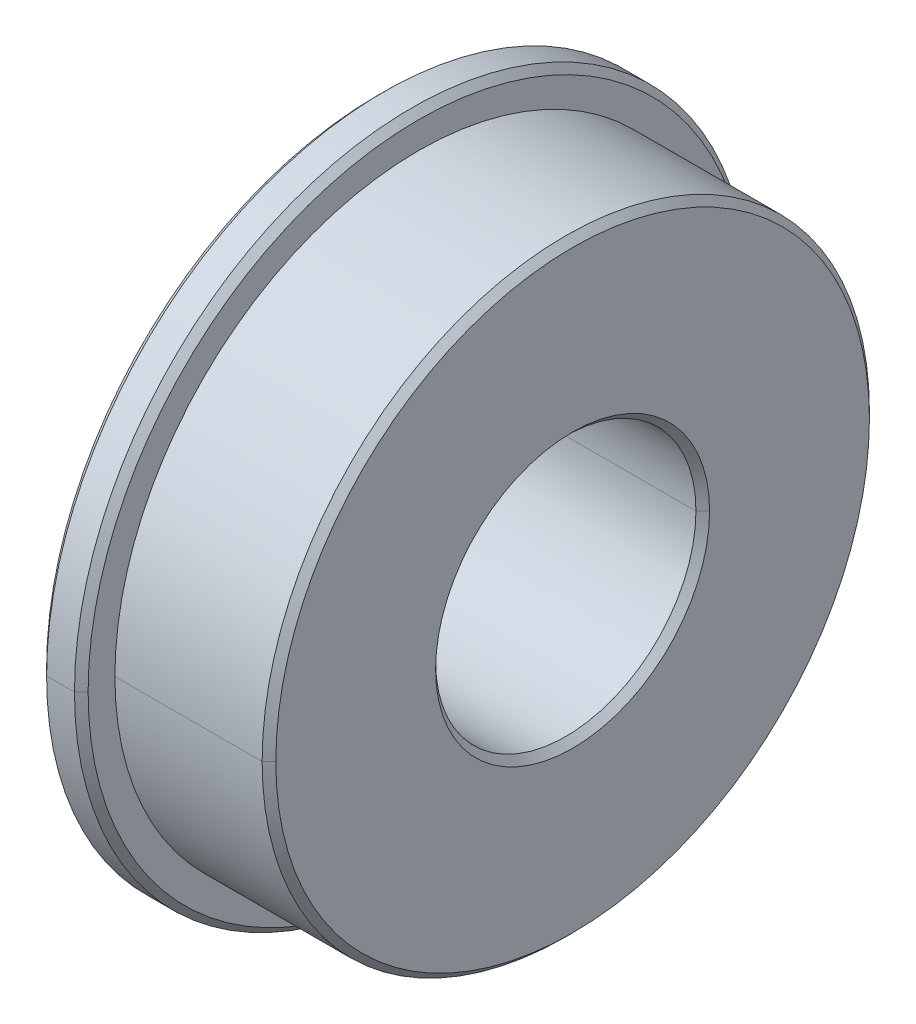
ISO-10303-21;
HEADER;
FILE_DESCRIPTION(('STEP AP214'),'2;1');
FILE_NAME('part.step','',(''),(''),'','','');
FILE_SCHEMA(('AUTOMOTIVE_DESIGN { 1 0 10303 214 1 1 1 1 }'));
ENDSEC;
DATA;
#1=APPLICATION_CONTEXT('core data for automotive mechanical design processes');
#2=APPLICATION_PROTOCOL_DEFINITION('international standard','automotive_design',2000,#1);
#3=PRODUCT_CONTEXT('',#1,'mechanical');
#4=PRODUCT('Part','Part','',(#3));
#5=PRODUCT_RELATED_PRODUCT_CATEGORY('part','',(#4));
#6=PRODUCT_DEFINITION_FORMATION('','',#4);
#7=PRODUCT_DEFINITION_CONTEXT('part definition',#1,'design');
#8=PRODUCT_DEFINITION('design','',#6,#7);
#9=PRODUCT_DEFINITION_SHAPE('','',#8);
#10=(LENGTH_UNIT() NAMED_UNIT(*) SI_UNIT(.MILLI.,.METRE.));
#11=(NAMED_UNIT(*) PLANE_ANGLE_UNIT() SI_UNIT($,.RADIAN.));
#12=(NAMED_UNIT(*) SI_UNIT($,.STERADIAN.) SOLID_ANGLE_UNIT());
#13=UNCERTAINTY_MEASURE_WITH_UNIT(LENGTH_MEASURE(1.E-05),#10,'distance_accuracy_value','');
#14=(GEOMETRIC_REPRESENTATION_CONTEXT(3) GLOBAL_UNCERTAINTY_ASSIGNED_CONTEXT((#13)) GLOBAL_UNIT_ASSIGNED_CONTEXT((#10,
#11,#12)) REPRESENTATION_CONTEXT('',''));
#15=CARTESIAN_POINT('',(0.,0.,0.));
#16=DIRECTION('',(0.,0.,1.));
#17=DIRECTION('',(1.,0.,0.));
#18=AXIS2_PLACEMENT_3D('',#15,#16,#17);
#19=CARTESIAN_POINT('',(0.25,0.,0.));
#20=DIRECTION('',(1.,0.,0.));
#21=DIRECTION('',(0.,0.,-1.));
#22=AXIS2_PLACEMENT_3D('',#19,#20,#21);
#23=CONICAL_SURFACE('',#22,12.345,0.785398163397448);
#24=CARTESIAN_POINT('',(0.,0.,0.));
#25=DIRECTION('',(-1.,0.,0.));
#26=DIRECTION('',(0.,0.,-1.));
#27=AXIS2_PLACEMENT_3D('',#24,#25,#26);
#28=CIRCLE('',#27,12.095);
#29=CARTESIAN_POINT('',(0.,0.,12.095));
#30=VERTEX_POINT('',#29);
#31=CARTESIAN_POINT('',(0.,0.,-12.095));
#32=VERTEX_POINT('',#31);
#33=EDGE_CURVE('E41',#30,#32,#28,.T.);
#34=ORIENTED_EDGE('',*,*,#33,.F.);
#35=DIRECTION('',(0.707106781186548,0.,0.707106781186548));
#36=VECTOR('',#35,1.);
#37=CARTESIAN_POINT('',(0.25,0.,12.345));
#38=LINE('',#37,#36);
#39=CARTESIAN_POINT('',(0.25,0.,12.345));
#40=VERTEX_POINT('',#39);
#41=EDGE_CURVE('E11',#30,#40,#38,.T.);
#42=ORIENTED_EDGE('',*,*,#41,.T.);
#43=CARTESIAN_POINT('',(0.25,0.,0.));
#44=DIRECTION('',(1.,0.,0.));
#45=DIRECTION('',(0.,0.,-1.));
#46=AXIS2_PLACEMENT_3D('',#43,#44,#45);
#47=CIRCLE('',#46,12.345);
#48=CARTESIAN_POINT('',(0.25,0.,-12.345));
#49=VERTEX_POINT('',#48);
#50=EDGE_CURVE('E180',#49,#40,#47,.T.);
#51=ORIENTED_EDGE('',*,*,#50,.F.);
#52=DIRECTION('',(0.707106781186548,0.,-0.707106781186548));
#53=VECTOR('',#52,1.);
#54=CARTESIAN_POINT('',(0.25,0.,-12.345));
#55=LINE('',#54,#53);
#56=EDGE_CURVE('E131',#32,#49,#55,.T.);
#57=ORIENTED_EDGE('',*,*,#56,.F.);
#58=EDGE_LOOP('',(#34,#42,#51,#57));
#59=FACE_BOUND('',#58,.T.);
#60=ADVANCED_FACE('F16',(#59),#23,.T.);
#61=CARTESIAN_POINT('',(1.52,0.,0.));
#62=DIRECTION('',(-1.,0.,0.));
#63=DIRECTION('',(0.,0.,1.));
#64=AXIS2_PLACEMENT_3D('',#61,#62,#63);
#65=CONICAL_SURFACE('',#64,12.095,0.785398163397438);
#66=CARTESIAN_POINT('',(1.52,0.,0.));
#67=DIRECTION('',(1.,0.,0.));
#68=DIRECTION('',(0.,0.,-1.));
#69=AXIS2_PLACEMENT_3D('',#66,#67,#68);
#70=CIRCLE('',#69,12.095);
#71=CARTESIAN_POINT('',(1.52,0.,-12.095));
#72=VERTEX_POINT('',#71);
#73=CARTESIAN_POINT('',(1.52,0.,12.095));
#74=VERTEX_POINT('',#73);
#75=EDGE_CURVE('E160',#72,#74,#70,.T.);
#76=ORIENTED_EDGE('',*,*,#75,.F.);
#77=DIRECTION('',(-0.707106781186555,0.,-0.70710678118654));
#78=VECTOR('',#77,1.);
#79=CARTESIAN_POINT('',(1.52,0.,-12.095));
#80=LINE('',#79,#78);
#81=CARTESIAN_POINT('',(1.27,0.,-12.345));
#82=VERTEX_POINT('',#81);
#83=EDGE_CURVE('E27',#72,#82,#80,.T.);
#84=ORIENTED_EDGE('',*,*,#83,.T.);
#85=CARTESIAN_POINT('',(1.27,0.,0.));
#86=DIRECTION('',(-1.,0.,0.));
#87=DIRECTION('',(0.,0.,-1.));
#88=AXIS2_PLACEMENT_3D('',#85,#86,#87);
#89=CIRCLE('',#88,12.345);
#90=CARTESIAN_POINT('',(1.27,0.,12.345));
#91=VERTEX_POINT('',#90);
#92=EDGE_CURVE('E104',#91,#82,#89,.T.);
#93=ORIENTED_EDGE('',*,*,#92,.F.);
#94=DIRECTION('',(-0.707106781186555,0.,0.70710678118654));
#95=VECTOR('',#94,1.);
#96=CARTESIAN_POINT('',(1.52,0.,12.095));
#97=LINE('',#96,#95);
#98=EDGE_CURVE('E134',#74,#91,#97,.T.);
#99=ORIENTED_EDGE('',*,*,#98,.F.);
#100=EDGE_LOOP('',(#76,#84,#93,#99));
#101=FACE_BOUND('',#100,.T.);
#102=ADVANCED_FACE('F271',(#101),#65,.T.);
#103=CARTESIAN_POINT('',(7.16,0.,0.));
#104=DIRECTION('',(-1.,0.,0.));
#105=DIRECTION('',(0.,0.,1.));
#106=AXIS2_PLACEMENT_3D('',#103,#104,#105);
#107=CONICAL_SURFACE('',#106,10.865,0.785398163397435);
#108=CARTESIAN_POINT('',(7.16,0.,0.));
#109=DIRECTION('',(1.,0.,0.));
#110=DIRECTION('',(0.,0.,-1.));
#111=AXIS2_PLACEMENT_3D('',#108,#109,#110);
#112=CIRCLE('',#111,10.865);
#113=CARTESIAN_POINT('',(7.16,0.,-10.865));
#114=VERTEX_POINT('',#113);
#115=CARTESIAN_POINT('',(7.16,0.,10.865));
#116=VERTEX_POINT('',#115);
#117=EDGE_CURVE('E128',#114,#116,#112,.T.);
#118=ORIENTED_EDGE('',*,*,#117,.F.);
#119=DIRECTION('',(-0.707106781186557,0.,-0.707106781186538));
#120=VECTOR('',#119,1.);
#121=CARTESIAN_POINT('',(7.16,0.,-10.865));
#122=LINE('',#121,#120);
#123=CARTESIAN_POINT('',(6.91,0.,-11.115));
#124=VERTEX_POINT('',#123);
#125=EDGE_CURVE('E150',#114,#124,#122,.T.);
#126=ORIENTED_EDGE('',*,*,#125,.T.);
#127=CARTESIAN_POINT('',(6.91,0.,0.));
#128=DIRECTION('',(-1.,0.,0.));
#129=DIRECTION('',(0.,0.,-1.));
#130=AXIS2_PLACEMENT_3D('',#127,#128,#129);
#131=CIRCLE('',#130,11.115);
#132=CARTESIAN_POINT('',(6.91,0.,11.115));
#133=VERTEX_POINT('',#132);
#134=EDGE_CURVE('E109',#133,#124,#131,.T.);
#135=ORIENTED_EDGE('',*,*,#134,.F.);
#136=DIRECTION('',(-0.707106781186557,0.,0.707106781186538));
#137=VECTOR('',#136,1.);
#138=CARTESIAN_POINT('',(7.16,0.,10.865));
#139=LINE('',#138,#137);
#140=EDGE_CURVE('E168',#116,#133,#139,.T.);
#141=ORIENTED_EDGE('',*,*,#140,.F.);
#142=EDGE_LOOP('',(#118,#126,#135,#141));
#143=FACE_BOUND('',#142,.T.);
#144=ADVANCED_FACE('F276',(#143),#107,.T.);
#145=CARTESIAN_POINT('',(6.91,0.,0.));
#146=DIRECTION('',(1.,0.,0.));
#147=DIRECTION('',(0.,0.,-1.));
#148=AXIS2_PLACEMENT_3D('',#145,#146,#147);
#149=CONICAL_SURFACE('',#148,4.765,0.785398163397452);
#150=CARTESIAN_POINT('',(6.91,0.,0.));
#151=DIRECTION('',(1.,0.,0.));
#152=DIRECTION('',(0.,0.,-1.));
#153=AXIS2_PLACEMENT_3D('',#150,#151,#152);
#154=CIRCLE('',#153,4.765);
#155=CARTESIAN_POINT('',(6.91,0.,4.765));
#156=VERTEX_POINT('',#155);
#157=CARTESIAN_POINT('',(6.91,0.,-4.765));
#158=VERTEX_POINT('',#157);
#159=EDGE_CURVE('E151',#156,#158,#154,.T.);
#160=ORIENTED_EDGE('',*,*,#159,.F.);
#161=DIRECTION('',(0.707106781186545,0.,0.70710678118655));
#162=VECTOR('',#161,1.);
#163=CARTESIAN_POINT('',(6.91,0.,4.765));
#164=LINE('',#163,#162);
#165=CARTESIAN_POINT('',(7.16,0.,5.015));
#166=VERTEX_POINT('',#165);
#167=EDGE_CURVE('E186',#156,#166,#164,.T.);
#168=ORIENTED_EDGE('',*,*,#167,.T.);
#169=CARTESIAN_POINT('',(7.16,0.,0.));
#170=DIRECTION('',(-1.,0.,0.));
#171=DIRECTION('',(0.,0.,-1.));
#172=AXIS2_PLACEMENT_3D('',#169,#170,#171);
#173=CIRCLE('',#172,5.015);
#174=CARTESIAN_POINT('',(7.16,0.,-5.015));
#175=VERTEX_POINT('',#174);
#176=EDGE_CURVE('E193',#175,#166,#173,.T.);
#177=ORIENTED_EDGE('',*,*,#176,.F.);
#178=DIRECTION('',(0.707106781186545,0.,-0.70710678118655));
#179=VECTOR('',#178,1.);
#180=CARTESIAN_POINT('',(6.91,0.,-4.765));
#181=LINE('',#180,#179);
#182=EDGE_CURVE('E172',#158,#175,#181,.T.);
#183=ORIENTED_EDGE('',*,*,#182,.F.);
#184=EDGE_LOOP('',(#160,#168,#177,#183));
#185=FACE_BOUND('',#184,.T.);
#186=ADVANCED_FACE('F297',(#185),#149,.F.);
#187=CARTESIAN_POINT('',(0.,0.,0.));
#188=DIRECTION('',(-1.,0.,0.));
#189=DIRECTION('',(0.,0.,1.));
#190=AXIS2_PLACEMENT_3D('',#187,#188,#189);
#191=CONICAL_SURFACE('',#190,5.015,0.785398163397452);
#192=CARTESIAN_POINT('',(0.249999999999998,0.,0.));
#193=DIRECTION('',(-1.,0.,0.));
#194=DIRECTION('',(0.,0.,-1.));
#195=AXIS2_PLACEMENT_3D('',#192,#193,#194);
#196=CIRCLE('',#195,4.765);
#197=CARTESIAN_POINT('',(0.249999999999998,0.,-4.765));
#198=VERTEX_POINT('',#197);
#199=CARTESIAN_POINT('',(0.249999999999998,0.,4.765));
#200=VERTEX_POINT('',#199);
#201=EDGE_CURVE('E135',#198,#200,#196,.T.);
#202=ORIENTED_EDGE('',*,*,#201,.F.);
#203=DIRECTION('',(-0.707106781186545,0.,-0.70710678118655));
#204=VECTOR('',#203,1.);
#205=CARTESIAN_POINT('',(0.,0.,-5.015));
#206=LINE('',#205,#204);
#207=CARTESIAN_POINT('',(0.,0.,-5.015));
#208=VERTEX_POINT('',#207);
#209=EDGE_CURVE('E139',#198,#208,#206,.T.);
#210=ORIENTED_EDGE('',*,*,#209,.T.);
#211=CARTESIAN_POINT('',(0.,0.,0.));
#212=DIRECTION('',(1.,0.,0.));
#213=DIRECTION('',(0.,0.,-1.));
#214=AXIS2_PLACEMENT_3D('',#211,#212,#213);
#215=CIRCLE('',#214,5.015);
#216=CARTESIAN_POINT('',(0.,0.,5.015));
#217=VERTEX_POINT('',#216);
#218=EDGE_CURVE('E155',#217,#208,#215,.T.);
#219=ORIENTED_EDGE('',*,*,#218,.F.);
#220=DIRECTION('',(-0.707106781186545,0.,0.70710678118655));
#221=VECTOR('',#220,1.);
#222=CARTESIAN_POINT('',(0.,0.,5.015));
#223=LINE('',#222,#221);
#224=EDGE_CURVE('E232',#200,#217,#223,.T.);
#225=ORIENTED_EDGE('',*,*,#224,.F.);
#226=EDGE_LOOP('',(#202,#210,#219,#225));
#227=FACE_BOUND('',#226,.T.);
#228=ADVANCED_FACE('F254',(#227),#191,.F.);
#229=CARTESIAN_POINT('',(0.,0.,0.));
#230=DIRECTION('',(1.,0.,0.));
#231=DIRECTION('',(0.,0.,-1.));
#232=AXIS2_PLACEMENT_3D('',#229,#230,#231);
#233=CYLINDRICAL_SURFACE('',#232,4.765);
#234=ORIENTED_EDGE('',*,*,#201,.T.);
#235=DIRECTION('',(1.,0.,0.));
#236=VECTOR('',#235,1.);
#237=CARTESIAN_POINT('',(0.,0.,4.765));
#238=LINE('',#237,#236);
#239=EDGE_CURVE('E140',#200,#156,#238,.T.);
#240=ORIENTED_EDGE('',*,*,#239,.T.);
#241=ORIENTED_EDGE('',*,*,#159,.T.);
#242=DIRECTION('',(1.,0.,0.));
#243=VECTOR('',#242,1.);
#244=CARTESIAN_POINT('',(0.,0.,-4.765));
#245=LINE('',#244,#243);
#246=EDGE_CURVE('E141',#198,#158,#245,.T.);
#247=ORIENTED_EDGE('',*,*,#246,.F.);
#248=EDGE_LOOP('',(#234,#240,#241,#247));
#249=FACE_BOUND('',#248,.T.);
#250=ADVANCED_FACE('F285',(#249),#233,.F.);
#251=CARTESIAN_POINT('',(7.16,0.,0.));
#252=DIRECTION('',(-1.,0.,0.));
#253=DIRECTION('',(0.,0.,1.));
#254=AXIS2_PLACEMENT_3D('',#251,#252,#253);
#255=CYLINDRICAL_SURFACE('',#254,11.115);
#256=ORIENTED_EDGE('',*,*,#134,.T.);
#257=DIRECTION('',(-1.,0.,0.));
#258=VECTOR('',#257,1.);
#259=CARTESIAN_POINT('',(7.16,0.,-11.115));
#260=LINE('',#259,#258);
#261=CARTESIAN_POINT('',(1.52,0.,-11.115));
#262=VERTEX_POINT('',#261);
#263=EDGE_CURVE('E103',#124,#262,#260,.T.);
#264=ORIENTED_EDGE('',*,*,#263,.T.);
#265=CARTESIAN_POINT('',(1.52,0.,0.));
#266=DIRECTION('',(1.,0.,0.));
#267=DIRECTION('',(0.,0.,-1.));
#268=AXIS2_PLACEMENT_3D('',#265,#266,#267);
#269=CIRCLE('',#268,11.115);
#270=CARTESIAN_POINT('',(1.52,0.,11.115));
#271=VERTEX_POINT('',#270);
#272=EDGE_CURVE('E95',#262,#271,#269,.T.);
#273=ORIENTED_EDGE('',*,*,#272,.T.);
#274=DIRECTION('',(-1.,0.,0.));
#275=VECTOR('',#274,1.);
#276=CARTESIAN_POINT('',(7.16,0.,11.115));
#277=LINE('',#276,#275);
#278=EDGE_CURVE('E116',#133,#271,#277,.T.);
#279=ORIENTED_EDGE('',*,*,#278,.F.);
#280=EDGE_LOOP('',(#256,#264,#273,#279));
#281=FACE_BOUND('',#280,.T.);
#282=ADVANCED_FACE('F107',(#281),#255,.T.);
#283=CARTESIAN_POINT('',(1.52,0.,0.));
#284=DIRECTION('',(-1.,0.,0.));
#285=DIRECTION('',(0.,0.,1.));
#286=AXIS2_PLACEMENT_3D('',#283,#284,#285);
#287=CYLINDRICAL_SURFACE('',#286,12.345);
#288=ORIENTED_EDGE('',*,*,#92,.T.);
#289=DIRECTION('',(-1.,0.,0.));
#290=VECTOR('',#289,1.);
#291=CARTESIAN_POINT('',(1.52,0.,-12.345));
#292=LINE('',#291,#290);
#293=EDGE_CURVE('E20',#82,#49,#292,.T.);
#294=ORIENTED_EDGE('',*,*,#293,.T.);
#295=ORIENTED_EDGE('',*,*,#50,.T.);
#296=DIRECTION('',(-1.,0.,0.));
#297=VECTOR('',#296,1.);
#298=CARTESIAN_POINT('',(1.52,0.,12.345));
#299=LINE('',#298,#297);
#300=EDGE_CURVE('E204',#91,#40,#299,.T.);
#301=ORIENTED_EDGE('',*,*,#300,.F.);
#302=EDGE_LOOP('',(#288,#294,#295,#301));
#303=FACE_BOUND('',#302,.T.);
#304=ADVANCED_FACE('F284',(#303),#287,.T.);
#305=CARTESIAN_POINT('',(1.52,0.,0.));
#306=DIRECTION('',(1.,0.,0.));
#307=DIRECTION('',(0.,1.,0.));
#308=AXIS2_PLACEMENT_3D('',#305,#306,#307);
#309=PLANE('',#308);
#310=CARTESIAN_POINT('',(1.52,0.,0.));
#311=DIRECTION('',(1.,0.,0.));
#312=DIRECTION('',(0.,0.,-1.));
#313=AXIS2_PLACEMENT_3D('',#310,#311,#312);
#314=CIRCLE('',#313,12.095);
#315=EDGE_CURVE('E163',#74,#72,#314,.T.);
#316=ORIENTED_EDGE('',*,*,#315,.T.);
#317=ORIENTED_EDGE('',*,*,#75,.T.);
#318=EDGE_LOOP('',(#316,#317));
#319=FACE_BOUND('',#318,.T.);
#320=CARTESIAN_POINT('',(1.52,0.,0.));
#321=DIRECTION('',(1.,0.,0.));
#322=DIRECTION('',(0.,0.,-1.));
#323=AXIS2_PLACEMENT_3D('',#320,#321,#322);
#324=CIRCLE('',#323,11.115);
#325=EDGE_CURVE('E99',#271,#262,#324,.T.);
#326=ORIENTED_EDGE('',*,*,#325,.F.);
#327=ORIENTED_EDGE('',*,*,#272,.F.);
#328=EDGE_LOOP('',(#326,#327));
#329=FACE_BOUND('',#328,.T.);
#330=ADVANCED_FACE('F97',(#319,#329),#309,.T.);
#331=CARTESIAN_POINT('',(1.52,0.,0.));
#332=DIRECTION('',(-1.,0.,0.));
#333=DIRECTION('',(0.,0.,1.));
#334=AXIS2_PLACEMENT_3D('',#331,#332,#333);
#335=CYLINDRICAL_SURFACE('',#334,12.345);
#336=ORIENTED_EDGE('',*,*,#293,.F.);
#337=CARTESIAN_POINT('',(1.27,0.,0.));
#338=DIRECTION('',(-1.,0.,0.));
#339=DIRECTION('',(0.,0.,-1.));
#340=AXIS2_PLACEMENT_3D('',#337,#338,#339);
#341=CIRCLE('',#340,12.345);
#342=EDGE_CURVE('E164',#82,#91,#341,.T.);
#343=ORIENTED_EDGE('',*,*,#342,.T.);
#344=ORIENTED_EDGE('',*,*,#300,.T.);
#345=CARTESIAN_POINT('',(0.25,0.,0.));
#346=DIRECTION('',(1.,0.,0.));
#347=DIRECTION('',(0.,0.,-1.));
#348=AXIS2_PLACEMENT_3D('',#345,#346,#347);
#349=CIRCLE('',#348,12.345);
#350=EDGE_CURVE('E199',#40,#49,#349,.T.);
#351=ORIENTED_EDGE('',*,*,#350,.T.);
#352=EDGE_LOOP('',(#336,#343,#344,#351));
#353=FACE_BOUND('',#352,.T.);
#354=ADVANCED_FACE('F258',(#353),#335,.T.);
#355=CARTESIAN_POINT('',(0.,0.,0.));
#356=DIRECTION('',(1.,0.,0.));
#357=DIRECTION('',(0.,1.,0.));
#358=AXIS2_PLACEMENT_3D('',#355,#356,#357);
#359=PLANE('',#358);
#360=CARTESIAN_POINT('',(0.,0.,0.));
#361=DIRECTION('',(-1.,0.,0.));
#362=DIRECTION('',(0.,0.,-1.));
#363=AXIS2_PLACEMENT_3D('',#360,#361,#362);
#364=CIRCLE('',#363,12.095);
#365=EDGE_CURVE('E196',#32,#30,#364,.T.);
#366=ORIENTED_EDGE('',*,*,#365,.T.);
#367=ORIENTED_EDGE('',*,*,#33,.T.);
#368=EDGE_LOOP('',(#366,#367));
#369=FACE_BOUND('',#368,.T.);
#370=ORIENTED_EDGE('',*,*,#218,.T.);
#371=CARTESIAN_POINT('',(0.,0.,0.));
#372=DIRECTION('',(1.,0.,0.));
#373=DIRECTION('',(0.,0.,-1.));
#374=AXIS2_PLACEMENT_3D('',#371,#372,#373);
#375=CIRCLE('',#374,5.015);
#376=EDGE_CURVE('E159',#208,#217,#375,.T.);
#377=ORIENTED_EDGE('',*,*,#376,.T.);
#378=EDGE_LOOP('',(#370,#377));
#379=FACE_BOUND('',#378,.T.);
#380=ADVANCED_FACE('F256',(#369,#379),#359,.F.);
#381=CARTESIAN_POINT('',(7.16,0.,0.));
#382=DIRECTION('',(-1.,0.,0.));
#383=DIRECTION('',(0.,0.,1.));
#384=AXIS2_PLACEMENT_3D('',#381,#382,#383);
#385=CYLINDRICAL_SURFACE('',#384,11.115);
#386=ORIENTED_EDGE('',*,*,#263,.F.);
#387=CARTESIAN_POINT('',(6.91,0.,0.));
#388=DIRECTION('',(-1.,0.,0.));
#389=DIRECTION('',(0.,0.,-1.));
#390=AXIS2_PLACEMENT_3D('',#387,#388,#389);
#391=CIRCLE('',#390,11.115);
#392=EDGE_CURVE('E124',#124,#133,#391,.T.);
#393=ORIENTED_EDGE('',*,*,#392,.T.);
#394=ORIENTED_EDGE('',*,*,#278,.T.);
#395=ORIENTED_EDGE('',*,*,#325,.T.);
#396=EDGE_LOOP('',(#386,#393,#394,#395));
#397=FACE_BOUND('',#396,.T.);
#398=ADVANCED_FACE('F115',(#397),#385,.T.);
#399=CARTESIAN_POINT('',(7.16,0.,0.));
#400=DIRECTION('',(1.,0.,0.));
#401=DIRECTION('',(0.,1.,0.));
#402=AXIS2_PLACEMENT_3D('',#399,#400,#401);
#403=PLANE('',#402);
#404=CARTESIAN_POINT('',(7.16,0.,0.));
#405=DIRECTION('',(1.,0.,0.));
#406=DIRECTION('',(0.,0.,-1.));
#407=AXIS2_PLACEMENT_3D('',#404,#405,#406);
#408=CIRCLE('',#407,10.865);
#409=EDGE_CURVE('E118',#116,#114,#408,.T.);
#410=ORIENTED_EDGE('',*,*,#409,.T.);
#411=ORIENTED_EDGE('',*,*,#117,.T.);
#412=EDGE_LOOP('',(#410,#411));
#413=FACE_BOUND('',#412,.T.);
#414=ORIENTED_EDGE('',*,*,#176,.T.);
#415=CARTESIAN_POINT('',(7.16,0.,0.));
#416=DIRECTION('',(-1.,0.,0.));
#417=DIRECTION('',(0.,0.,-1.));
#418=AXIS2_PLACEMENT_3D('',#415,#416,#417);
#419=CIRCLE('',#418,5.015);
#420=EDGE_CURVE('E176',#166,#175,#419,.T.);
#421=ORIENTED_EDGE('',*,*,#420,.T.);
#422=EDGE_LOOP('',(#414,#421));
#423=FACE_BOUND('',#422,.T.);
#424=ADVANCED_FACE('F266',(#413,#423),#403,.T.);
#425=CARTESIAN_POINT('',(0.,0.,0.));
#426=DIRECTION('',(1.,0.,0.));
#427=DIRECTION('',(0.,0.,-1.));
#428=AXIS2_PLACEMENT_3D('',#425,#426,#427);
#429=CYLINDRICAL_SURFACE('',#428,4.765);
#430=ORIENTED_EDGE('',*,*,#239,.F.);
#431=CARTESIAN_POINT('',(0.249999999999998,0.,0.));
#432=DIRECTION('',(-1.,0.,0.));
#433=DIRECTION('',(0.,0.,-1.));
#434=AXIS2_PLACEMENT_3D('',#431,#432,#433);
#435=CIRCLE('',#434,4.765);
#436=EDGE_CURVE('E145',#200,#198,#435,.T.);
#437=ORIENTED_EDGE('',*,*,#436,.T.);
#438=ORIENTED_EDGE('',*,*,#246,.T.);
#439=CARTESIAN_POINT('',(6.91,0.,0.));
#440=DIRECTION('',(1.,0.,0.));
#441=DIRECTION('',(0.,0.,-1.));
#442=AXIS2_PLACEMENT_3D('',#439,#440,#441);
#443=CIRCLE('',#442,4.765);
#444=EDGE_CURVE('E146',#158,#156,#443,.T.);
#445=ORIENTED_EDGE('',*,*,#444,.T.);
#446=EDGE_LOOP('',(#430,#437,#438,#445));
#447=FACE_BOUND('',#446,.T.);
#448=ADVANCED_FACE('F281',(#447),#429,.F.);
#449=CARTESIAN_POINT('',(0.,0.,0.));
#450=DIRECTION('',(-1.,0.,0.));
#451=DIRECTION('',(0.,0.,1.));
#452=AXIS2_PLACEMENT_3D('',#449,#450,#451);
#453=CONICAL_SURFACE('',#452,5.015,0.785398163397452);
#454=ORIENTED_EDGE('',*,*,#209,.F.);
#455=ORIENTED_EDGE('',*,*,#436,.F.);
#456=ORIENTED_EDGE('',*,*,#224,.T.);
#457=ORIENTED_EDGE('',*,*,#376,.F.);
#458=EDGE_LOOP('',(#454,#455,#456,#457));
#459=FACE_BOUND('',#458,.T.);
#460=ADVANCED_FACE('F248',(#459),#453,.F.);
#461=CARTESIAN_POINT('',(6.91,0.,0.));
#462=DIRECTION('',(1.,0.,0.));
#463=DIRECTION('',(0.,0.,-1.));
#464=AXIS2_PLACEMENT_3D('',#461,#462,#463);
#465=CONICAL_SURFACE('',#464,4.765,0.785398163397452);
#466=ORIENTED_EDGE('',*,*,#167,.F.);
#467=ORIENTED_EDGE('',*,*,#444,.F.);
#468=ORIENTED_EDGE('',*,*,#182,.T.);
#469=ORIENTED_EDGE('',*,*,#420,.F.);
#470=EDGE_LOOP('',(#466,#467,#468,#469));
#471=FACE_BOUND('',#470,.T.);
#472=ADVANCED_FACE('F294',(#471),#465,.F.);
#473=CARTESIAN_POINT('',(7.16,0.,0.));
#474=DIRECTION('',(-1.,0.,0.));
#475=DIRECTION('',(0.,0.,1.));
#476=AXIS2_PLACEMENT_3D('',#473,#474,#475);
#477=CONICAL_SURFACE('',#476,10.865,0.785398163397435);
#478=ORIENTED_EDGE('',*,*,#125,.F.);
#479=ORIENTED_EDGE('',*,*,#409,.F.);
#480=ORIENTED_EDGE('',*,*,#140,.T.);
#481=ORIENTED_EDGE('',*,*,#392,.F.);
#482=EDGE_LOOP('',(#478,#479,#480,#481));
#483=FACE_BOUND('',#482,.T.);
#484=ADVANCED_FACE('F290',(#483),#477,.T.);
#485=CARTESIAN_POINT('',(1.52,0.,0.));
#486=DIRECTION('',(-1.,0.,0.));
#487=DIRECTION('',(0.,0.,1.));
#488=AXIS2_PLACEMENT_3D('',#485,#486,#487);
#489=CONICAL_SURFACE('',#488,12.095,0.785398163397438);
#490=ORIENTED_EDGE('',*,*,#83,.F.);
#491=ORIENTED_EDGE('',*,*,#315,.F.);
#492=ORIENTED_EDGE('',*,*,#98,.T.);
#493=ORIENTED_EDGE('',*,*,#342,.F.);
#494=EDGE_LOOP('',(#490,#491,#492,#493));
#495=FACE_BOUND('',#494,.T.);
#496=ADVANCED_FACE('F293',(#495),#489,.T.);
#497=CARTESIAN_POINT('',(0.25,0.,0.));
#498=DIRECTION('',(1.,0.,0.));
#499=DIRECTION('',(0.,0.,-1.));
#500=AXIS2_PLACEMENT_3D('',#497,#498,#499);
#501=CONICAL_SURFACE('',#500,12.345,0.785398163397448);
#502=ORIENTED_EDGE('',*,*,#41,.F.);
#503=ORIENTED_EDGE('',*,*,#365,.F.);
#504=ORIENTED_EDGE('',*,*,#56,.T.);
#505=ORIENTED_EDGE('',*,*,#350,.F.);
#506=EDGE_LOOP('',(#502,#503,#504,#505));
#507=FACE_BOUND('',#506,.T.);
#508=ADVANCED_FACE('F18',(#507),#501,.T.);
#509=CLOSED_SHELL('',(#60,#102,#144,#186,#228,#250,#282,#304,#330,#354,#380,#398,#424,#448,#460,
#472,#484,#496,#508));
#510=MANIFOLD_SOLID_BREP('B1',#509);
#511=ADVANCED_BREP_SHAPE_REPRESENTATION('',(#18,#510),#14);
#512=SHAPE_DEFINITION_REPRESENTATION(#9,#511);
ENDSEC;
END-ISO-10303-21;
